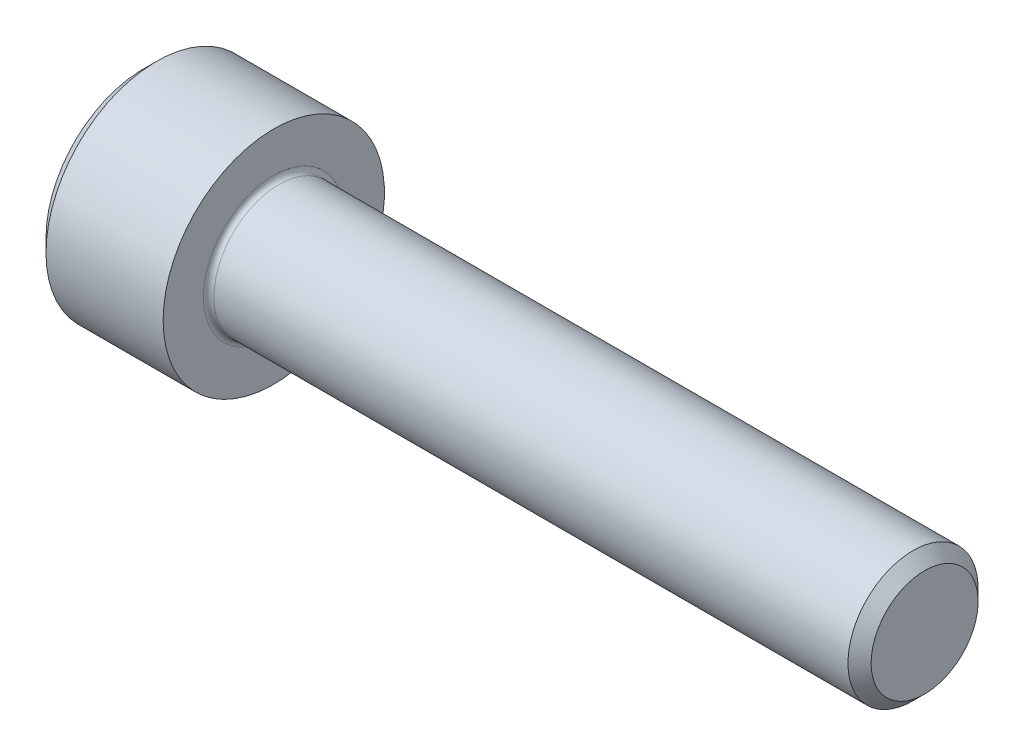
ISO-10303-21;
HEADER;
FILE_DESCRIPTION(('STEP AP214'),'2;1');
FILE_NAME('part.step','',(''),(''),'','','');
FILE_SCHEMA(('AUTOMOTIVE_DESIGN { 1 0 10303 214 1 1 1 1 }'));
ENDSEC;
DATA;
#1=APPLICATION_CONTEXT('core data for automotive mechanical design processes');
#2=APPLICATION_PROTOCOL_DEFINITION('international standard','automotive_design',2000,#1);
#3=PRODUCT_CONTEXT('',#1,'mechanical');
#4=PRODUCT('Part','Part','',(#3));
#5=PRODUCT_RELATED_PRODUCT_CATEGORY('part','',(#4));
#6=PRODUCT_DEFINITION_FORMATION('','',#4);
#7=PRODUCT_DEFINITION_CONTEXT('part definition',#1,'design');
#8=PRODUCT_DEFINITION('design','',#6,#7);
#9=PRODUCT_DEFINITION_SHAPE('','',#8);
#10=(LENGTH_UNIT() NAMED_UNIT(*) SI_UNIT(.MILLI.,.METRE.));
#11=(NAMED_UNIT(*) PLANE_ANGLE_UNIT() SI_UNIT($,.RADIAN.));
#12=(NAMED_UNIT(*) SI_UNIT($,.STERADIAN.) SOLID_ANGLE_UNIT());
#13=UNCERTAINTY_MEASURE_WITH_UNIT(LENGTH_MEASURE(1.E-05),#10,'distance_accuracy_value','');
#14=(GEOMETRIC_REPRESENTATION_CONTEXT(3) GLOBAL_UNCERTAINTY_ASSIGNED_CONTEXT((#13)) GLOBAL_UNIT_ASSIGNED_CONTEXT((#10,
#11,#12)) REPRESENTATION_CONTEXT('',''));
#15=CARTESIAN_POINT('',(0.,0.,0.));
#16=DIRECTION('',(0.,0.,1.));
#17=DIRECTION('',(1.,0.,0.));
#18=AXIS2_PLACEMENT_3D('',#15,#16,#17);
#19=CARTESIAN_POINT('',(0.,0.,0.));
#20=DIRECTION('',(-1.,0.,0.));
#21=DIRECTION('',(0.,0.,1.));
#22=AXIS2_PLACEMENT_3D('',#19,#20,#21);
#23=PLANE('',#22);
#24=CARTESIAN_POINT('',(0.,0.,0.));
#25=DIRECTION('',(-1.,0.,0.));
#26=DIRECTION('',(0.,0.,1.));
#27=AXIS2_PLACEMENT_3D('',#24,#25,#26);
#28=CIRCLE('',#27,3.75);
#29=CARTESIAN_POINT('',(0.,0.,3.75));
#30=VERTEX_POINT('',#29);
#31=EDGE_CURVE('E44',#30,#30,#28,.T.);
#32=ORIENTED_EDGE('',*,*,#31,.T.);
#33=EDGE_LOOP('',(#32));
#34=FACE_BOUND('',#33,.T.);
#35=ADVANCED_FACE('F33',(#34),#23,.T.);
#36=CARTESIAN_POINT('',(0.,0.,0.));
#37=DIRECTION('',(1.,0.,0.));
#38=DIRECTION('',(0.,0.,-1.));
#39=AXIS2_PLACEMENT_3D('',#36,#37,#38);
#40=CONICAL_SURFACE('',#39,3.75,0.785398163397449);
#41=CARTESIAN_POINT('',(0.5,0.,0.));
#42=DIRECTION('',(-1.,0.,0.));
#43=DIRECTION('',(0.,0.,1.));
#44=AXIS2_PLACEMENT_3D('',#41,#42,#43);
#45=CIRCLE('',#44,4.25);
#46=CARTESIAN_POINT('',(0.5,0.,4.25));
#47=VERTEX_POINT('',#46);
#48=EDGE_CURVE('E48',#47,#47,#45,.T.);
#49=ORIENTED_EDGE('',*,*,#48,.T.);
#50=EDGE_LOOP('',(#49));
#51=FACE_BOUND('',#50,.T.);
#52=ORIENTED_EDGE('',*,*,#31,.F.);
#53=EDGE_LOOP('',(#52));
#54=FACE_BOUND('',#53,.T.);
#55=ADVANCED_FACE('F77',(#51,#54),#40,.T.);
#56=CARTESIAN_POINT('',(-31.75,0.,0.));
#57=DIRECTION('',(-1.,0.,0.));
#58=DIRECTION('',(0.,0.,1.));
#59=AXIS2_PLACEMENT_3D('',#56,#57,#58);
#60=CYLINDRICAL_SURFACE('',#59,4.25);
#61=CARTESIAN_POINT('',(5.,0.,0.));
#62=DIRECTION('',(-1.,0.,0.));
#63=DIRECTION('',(0.,0.,1.));
#64=AXIS2_PLACEMENT_3D('',#61,#62,#63);
#65=CIRCLE('',#64,4.25);
#66=CARTESIAN_POINT('',(5.,0.,4.25));
#67=VERTEX_POINT('',#66);
#68=EDGE_CURVE('E53',#67,#67,#65,.T.);
#69=ORIENTED_EDGE('',*,*,#68,.T.);
#70=EDGE_LOOP('',(#69));
#71=FACE_BOUND('',#70,.T.);
#72=ORIENTED_EDGE('',*,*,#48,.F.);
#73=EDGE_LOOP('',(#72));
#74=FACE_BOUND('',#73,.T.);
#75=ADVANCED_FACE('F82',(#71,#74),#60,.T.);
#76=CARTESIAN_POINT('',(5.,4.25,0.));
#77=DIRECTION('',(1.,0.,0.));
#78=DIRECTION('',(0.,0.,-1.));
#79=AXIS2_PLACEMENT_3D('',#76,#77,#78);
#80=PLANE('',#79);
#81=CARTESIAN_POINT('',(5.,0.,0.));
#82=DIRECTION('',(1.,0.,0.));
#83=DIRECTION('',(0.,0.,-1.));
#84=AXIS2_PLACEMENT_3D('',#81,#82,#83);
#85=CIRCLE('',#84,2.69999999999998);
#86=CARTESIAN_POINT('',(5.,0.,-2.69999999999998));
#87=VERTEX_POINT('',#86);
#88=EDGE_CURVE('E40',#87,#87,#85,.F.);
#89=ORIENTED_EDGE('',*,*,#88,.T.);
#90=EDGE_LOOP('',(#89));
#91=FACE_BOUND('',#90,.T.);
#92=ORIENTED_EDGE('',*,*,#68,.F.);
#93=EDGE_LOOP('',(#92));
#94=FACE_BOUND('',#93,.T.);
#95=ADVANCED_FACE('F88',(#91,#94),#80,.T.);
#96=CARTESIAN_POINT('',(-31.75,0.,0.));
#97=DIRECTION('',(-1.,0.,0.));
#98=DIRECTION('',(0.,0.,1.));
#99=AXIS2_PLACEMENT_3D('',#96,#97,#98);
#100=CYLINDRICAL_SURFACE('',#99,2.49999999999998);
#101=CARTESIAN_POINT('',(5.2,0.,0.));
#102=DIRECTION('',(1.,0.,0.));
#103=DIRECTION('',(0.,0.,-1.));
#104=AXIS2_PLACEMENT_3D('',#101,#102,#103);
#105=CIRCLE('',#104,2.49999999999998);
#106=CARTESIAN_POINT('',(5.2,0.,-2.49999999999998));
#107=VERTEX_POINT('',#106);
#108=EDGE_CURVE('E10',#107,#107,#105,.T.);
#109=ORIENTED_EDGE('',*,*,#108,.T.);
#110=EDGE_LOOP('',(#109));
#111=FACE_BOUND('',#110,.T.);
#112=CARTESIAN_POINT('',(29.555,0.,0.));
#113=DIRECTION('',(-1.,0.,0.));
#114=DIRECTION('',(0.,0.,1.));
#115=AXIS2_PLACEMENT_3D('',#112,#113,#114);
#116=CIRCLE('',#115,2.49999999999995);
#117=CARTESIAN_POINT('',(29.555,0.,2.49999999999995));
#118=VERTEX_POINT('',#117);
#119=EDGE_CURVE('E56',#118,#118,#116,.T.);
#120=ORIENTED_EDGE('',*,*,#119,.T.);
#121=EDGE_LOOP('',(#120));
#122=FACE_BOUND('',#121,.T.);
#123=ADVANCED_FACE('F73',(#111,#122),#100,.T.);
#124=CARTESIAN_POINT('',(30.,0.,0.));
#125=DIRECTION('',(-1.,0.,0.));
#126=DIRECTION('',(0.,0.,1.));
#127=AXIS2_PLACEMENT_3D('',#124,#125,#126);
#128=CONICAL_SURFACE('',#127,2.055,0.785398163397349);
#129=ORIENTED_EDGE('',*,*,#119,.F.);
#130=EDGE_LOOP('',(#129));
#131=FACE_BOUND('',#130,.T.);
#132=CARTESIAN_POINT('',(30.,0.,0.));
#133=DIRECTION('',(-1.,0.,0.));
#134=DIRECTION('',(0.,0.,1.));
#135=AXIS2_PLACEMENT_3D('',#132,#133,#134);
#136=CIRCLE('',#135,2.055);
#137=CARTESIAN_POINT('',(30.,0.,2.055));
#138=VERTEX_POINT('',#137);
#139=EDGE_CURVE('E59',#138,#138,#136,.T.);
#140=ORIENTED_EDGE('',*,*,#139,.T.);
#141=EDGE_LOOP('',(#140));
#142=FACE_BOUND('',#141,.T.);
#143=ADVANCED_FACE('F63',(#131,#142),#128,.T.);
#144=CARTESIAN_POINT('',(30.,2.055,0.));
#145=DIRECTION('',(1.,0.,0.));
#146=DIRECTION('',(0.,0.,-1.));
#147=AXIS2_PLACEMENT_3D('',#144,#145,#146);
#148=PLANE('',#147);
#149=ORIENTED_EDGE('',*,*,#139,.F.);
#150=EDGE_LOOP('',(#149));
#151=FACE_BOUND('',#150,.T.);
#152=ADVANCED_FACE('F65',(#151),#148,.T.);
#153=CARTESIAN_POINT('',(5.2,0.,0.));
#154=DIRECTION('',(1.,0.,0.));
#155=DIRECTION('',(0.,0.,-1.));
#156=AXIS2_PLACEMENT_3D('',#153,#154,#155);
#157=TOROIDAL_SURFACE('',#156,2.69999999999998,0.2);
#158=ORIENTED_EDGE('',*,*,#108,.F.);
#159=EDGE_LOOP('',(#158));
#160=FACE_BOUND('',#159,.T.);
#161=ORIENTED_EDGE('',*,*,#88,.F.);
#162=EDGE_LOOP('',(#161));
#163=FACE_BOUND('',#162,.T.);
#164=ADVANCED_FACE('F35',(#160,#163),#157,.F.);
#165=CLOSED_SHELL('',(#35,#55,#75,#95,#123,#143,#152,#164));
#166=MANIFOLD_SOLID_BREP('B2',#165);
#167=ADVANCED_BREP_SHAPE_REPRESENTATION('',(#18,#166),#14);
#168=SHAPE_DEFINITION_REPRESENTATION(#9,#167);
ENDSEC;
END-ISO-10303-21;
